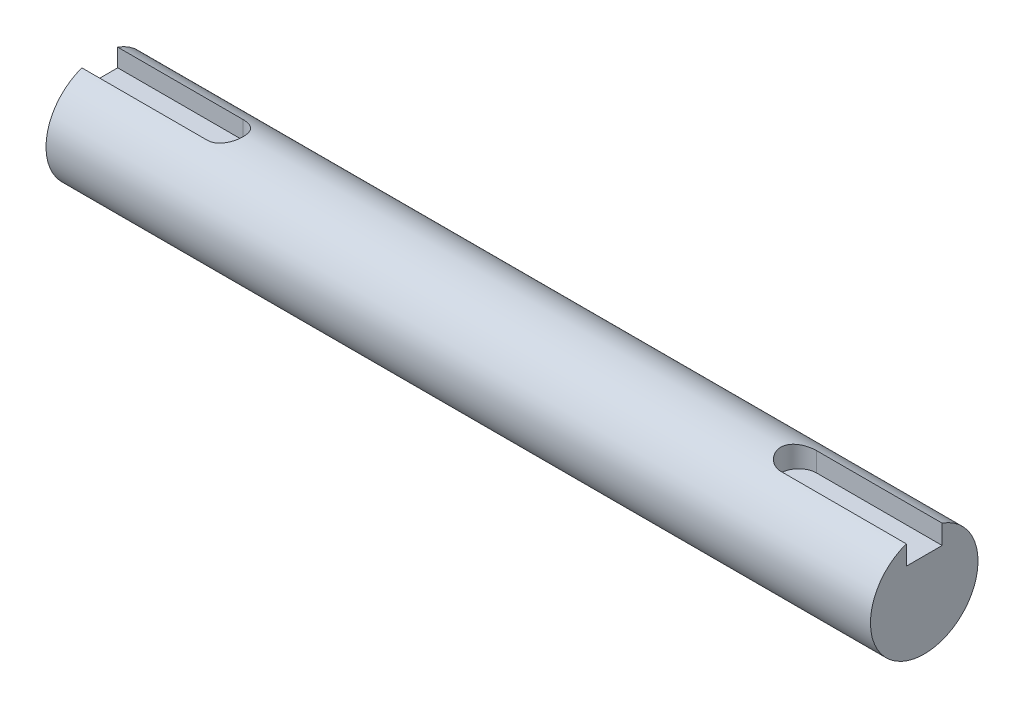
ISO-10303-21;
HEADER;
FILE_DESCRIPTION(('STEP AP214'),'2;1');
FILE_NAME('part.step','',(''),(''),'','','');
FILE_SCHEMA(('AUTOMOTIVE_DESIGN { 1 0 10303 214 1 1 1 1 }'));
ENDSEC;
DATA;
#1=APPLICATION_CONTEXT('core data for automotive mechanical design processes');
#2=APPLICATION_PROTOCOL_DEFINITION('international standard','automotive_design',2000,#1);
#3=PRODUCT_CONTEXT('',#1,'mechanical');
#4=PRODUCT('Part','Part','',(#3));
#5=PRODUCT_RELATED_PRODUCT_CATEGORY('part','',(#4));
#6=PRODUCT_DEFINITION_FORMATION('','',#4);
#7=PRODUCT_DEFINITION_CONTEXT('part definition',#1,'design');
#8=PRODUCT_DEFINITION('design','',#6,#7);
#9=PRODUCT_DEFINITION_SHAPE('','',#8);
#10=(LENGTH_UNIT() NAMED_UNIT(*) SI_UNIT(.MILLI.,.METRE.));
#11=(NAMED_UNIT(*) PLANE_ANGLE_UNIT() SI_UNIT($,.RADIAN.));
#12=(NAMED_UNIT(*) SI_UNIT($,.STERADIAN.) SOLID_ANGLE_UNIT());
#13=UNCERTAINTY_MEASURE_WITH_UNIT(LENGTH_MEASURE(1.E-05),#10,'distance_accuracy_value','');
#14=(GEOMETRIC_REPRESENTATION_CONTEXT(3) GLOBAL_UNCERTAINTY_ASSIGNED_CONTEXT((#13)) GLOBAL_UNIT_ASSIGNED_CONTEXT((#10,
#11,#12)) REPRESENTATION_CONTEXT('',''));
#15=CARTESIAN_POINT('',(0.,0.,0.));
#16=DIRECTION('',(0.,0.,1.));
#17=DIRECTION('',(1.,0.,0.));
#18=AXIS2_PLACEMENT_3D('',#15,#16,#17);
#19=CARTESIAN_POINT('',(115.,0.,0.));
#20=DIRECTION('',(-1.,0.,0.));
#21=DIRECTION('',(0.,0.,1.));
#22=AXIS2_PLACEMENT_3D('',#19,#20,#21);
#23=CYLINDRICAL_SURFACE('',#22,7.5);
#24=CARTESIAN_POINT('',(115.,0.,0.));
#25=DIRECTION('',(1.,0.,0.));
#26=DIRECTION('',(0.,0.,-1.));
#27=AXIS2_PLACEMENT_3D('',#24,#25,#26);
#28=CIRCLE('',#27,7.5);
#29=CARTESIAN_POINT('',(115.,7.07106781186542,2.49999999999989));
#30=VERTEX_POINT('',#29);
#31=CARTESIAN_POINT('',(115.,7.07106781186539,-2.50000000000006));
#32=VERTEX_POINT('',#31);
#33=EDGE_CURVE('E136',#30,#32,#28,.T.);
#34=ORIENTED_EDGE('',*,*,#33,.F.);
#35=DIRECTION('',(-1.,0.,0.));
#36=VECTOR('',#35,1.);
#37=CARTESIAN_POINT('',(115.,7.07106781186542,2.49999999999989));
#38=LINE('',#37,#36);
#39=CARTESIAN_POINT('',(97.5,7.07106781186551,2.49999999999995));
#40=VERTEX_POINT('',#39);
#41=EDGE_CURVE('E150',#30,#40,#38,.T.);
#42=ORIENTED_EDGE('',*,*,#41,.T.);
#43=CARTESIAN_POINT('',(97.5,7.07106781186551,2.49999999999995));
#44=CARTESIAN_POINT('',(97.4317929221797,7.07105693273155,2.50000899110396));
#45=CARTESIAN_POINT('',(97.3635919253246,7.07205443904565,2.49720887221574));
#46=CARTESIAN_POINT('',(97.2277189616507,7.07598524121002,2.48606045780459));
#47=CARTESIAN_POINT('',(97.1600468570119,7.07891801450638,2.47771365997191));
#48=CARTESIAN_POINT('',(97.0259095116454,7.08662705252502,2.45557459422784));
#49=CARTESIAN_POINT('',(96.9594412974491,7.09139784850113,2.44179847763122));
#50=CARTESIAN_POINT('',(96.8279917314172,7.10262619905999,2.40894181030109));
#51=CARTESIAN_POINT('',(96.7630104334101,7.10908381460331,2.38986106786025));
#52=CARTESIAN_POINT('',(96.5710384202854,7.13069940793916,2.32491551306193));
#53=CARTESIAN_POINT('',(96.44682084253,7.14811243884048,2.2713141681024));
#54=CARTESIAN_POINT('',(96.2091231885366,7.18697034087513,2.14517784106243));
#55=CARTESIAN_POINT('',(96.0956497642198,7.20841768551074,2.07263123268525));
#56=CARTESIAN_POINT('',(95.8782070965292,7.25386182389475,1.90762995846814));
#57=CARTESIAN_POINT('',(95.7747148572318,7.27792189428057,1.81456284630826));
#58=CARTESIAN_POINT('',(95.5844828967664,7.32534626726034,1.61247071190504));
#59=CARTESIAN_POINT('',(95.4977461586811,7.34871044533526,1.50344285413651));
#60=CARTESIAN_POINT('',(95.3413017757376,7.3928470609635,1.26900922493966));
#61=CARTESIAN_POINT('',(95.2720976922578,7.41353593532881,1.14325025284454));
#62=CARTESIAN_POINT('',(95.1560192175653,7.44924021883271,0.881073095475224));
#63=CARTESIAN_POINT('',(95.1091380050743,7.4642573608121,0.744658181225826));
#64=CARTESIAN_POINT('',(95.0406607237418,7.48647677762789,0.470073371182857));
#65=CARTESIAN_POINT('',(95.0182418290428,7.49393272446136,0.33212958815369));
#66=CARTESIAN_POINT('',(94.9967092432615,7.50109021034816,0.054247421636145));
#67=CARTESIAN_POINT('',(94.9975899990843,7.50079359709903,-0.0856904786402715));
#68=CARTESIAN_POINT('',(95.0221107104005,7.49265096581773,-0.357759612692468));
#69=CARTESIAN_POINT('',(95.0448565956047,7.48510152476435,-0.489981756428245));
#70=CARTESIAN_POINT('',(95.1109829959792,7.46367401253765,-0.748610161077404));
#71=CARTESIAN_POINT('',(95.1543646553253,7.44979559044795,-0.87501609907784));
#72=CARTESIAN_POINT('',(95.2610534241945,7.41689170677797,-1.12038155754045));
#73=CARTESIAN_POINT('',(95.3246151128576,7.39780094595646,-1.23922126412512));
#74=CARTESIAN_POINT('',(95.4696498784249,7.35645969200226,-1.46481147275374));
#75=CARTESIAN_POINT('',(95.5511278276021,7.33420833994022,-1.5715586742895));
#76=CARTESIAN_POINT('',(95.734177625007,7.28765679856817,-1.77524334927525));
#77=CARTESIAN_POINT('',(95.8365138590282,7.26330946699765,-1.87148402903107));
#78=CARTESIAN_POINT('',(96.0561037242864,7.21618726182128,-2.04568006205178));
#79=CARTESIAN_POINT('',(96.173362156007,7.19341289789392,-2.12362950795975));
#80=CARTESIAN_POINT('',(96.4217004458843,7.15175078440797,-2.26000831398178));
#81=CARTESIAN_POINT('',(96.5529587873326,7.13292537370575,-2.31813252376926));
#82=CARTESIAN_POINT('',(96.8241174439746,7.10202742655086,-2.41115057675294));
#83=CARTESIAN_POINT('',(96.9640037334303,7.08994423522486,-2.4460810901384));
#84=CARTESIAN_POINT('',(97.17104659187,7.07841355236797,-2.47914539070212));
#85=CARTESIAN_POINT('',(97.2366034746356,7.07566669236495,-2.48696265313788));
#86=CARTESIAN_POINT('',(97.3680951959995,7.07199258928482,-2.49738654017813));
#87=CARTESIAN_POINT('',(97.434029436361,7.07106299823806,-2.49999988848758));
#88=CARTESIAN_POINT('',(97.5,7.07106781186548,-2.50000000000006));
#89=B_SPLINE_CURVE_WITH_KNOTS('',3,(#43,#44,#45,#46,#47,#48,#49,#50,#51,#52,#53,#54,#55,#56,#57,
#58,#59,#60,#61,#62,#63,#64,#65,#66,#67,#68,#69,#70,#71,#72,#73,#74,#75,#76,#77,#78,#79,#80,#81,
#82,#83,#84,#85,#86,#87,#88),.UNSPECIFIED.,.F.,.F.,(4,2,2,2,2,2,2,2,2,2,2,2,2,2,2,2,2,2,2,2,2,2,
4),(0.,0.204546211838589,0.409037215423664,0.612924429429115,0.816819012805419,1.22401016923255,
1.63145179965519,2.05327864088385,2.4751805134106,2.90809434014445,3.34087579484509,
3.75860278500198,4.17623021758297,4.57747647846031,4.97874498952315,5.38529148746612,
5.79194868153613,6.21771736826817,6.64362337304795,7.0758167650179,7.50732520398793,
7.70536340013573,7.90314555504336),.UNSPECIFIED.);
#90=CARTESIAN_POINT('',(97.5,7.07106781186548,-2.50000000000006));
#91=VERTEX_POINT('',#90);
#92=EDGE_CURVE('E11',#40,#91,#89,.T.);
#93=ORIENTED_EDGE('',*,*,#92,.T.);
#94=DIRECTION('',(-1.,0.,0.));
#95=VECTOR('',#94,1.);
#96=CARTESIAN_POINT('',(115.,7.07106781186539,-2.50000000000006));
#97=LINE('',#96,#95);
#98=EDGE_CURVE('E147',#91,#32,#97,.F.);
#99=ORIENTED_EDGE('',*,*,#98,.T.);
#100=EDGE_LOOP('',(#34,#42,#93,#99));
#101=FACE_BOUND('',#100,.T.);
#102=CARTESIAN_POINT('',(0.,0.,0.));
#103=DIRECTION('',(1.,0.,0.));
#104=DIRECTION('',(0.,0.,-1.));
#105=AXIS2_PLACEMENT_3D('',#102,#103,#104);
#106=CIRCLE('',#105,7.5);
#107=CARTESIAN_POINT('',(0.,7.07106781186548,2.49999999999995));
#108=VERTEX_POINT('',#107);
#109=CARTESIAN_POINT('',(0.,7.07106781186548,-2.50000000000017));
#110=VERTEX_POINT('',#109);
#111=EDGE_CURVE('E187',#108,#110,#106,.T.);
#112=ORIENTED_EDGE('',*,*,#111,.T.);
#113=DIRECTION('',(-1.,0.,0.));
#114=VECTOR('',#113,1.);
#115=CARTESIAN_POINT('',(115.,7.07106781186539,-2.50000000000006));
#116=LINE('',#115,#114);
#117=CARTESIAN_POINT('',(17.5,7.07106781186542,-2.50000000000006));
#118=VERTEX_POINT('',#117);
#119=EDGE_CURVE('E183',#110,#118,#116,.F.);
#120=ORIENTED_EDGE('',*,*,#119,.T.);
#121=CARTESIAN_POINT('',(17.5,7.07106781186542,-2.50000000000006));
#122=CARTESIAN_POINT('',(17.5682070778203,7.07105693273147,-2.50000899110415));
#123=CARTESIAN_POINT('',(17.6364080746754,7.07205443904558,-2.49720887221595));
#124=CARTESIAN_POINT('',(17.7722810383493,7.07598524120995,-2.48606045780482));
#125=CARTESIAN_POINT('',(17.8399531429881,7.0789180145063,-2.47771365997213));
#126=CARTESIAN_POINT('',(17.9740904883546,7.08662705252495,-2.45557459422806));
#127=CARTESIAN_POINT('',(18.0405587025509,7.09139784850106,-2.44179847763148));
#128=CARTESIAN_POINT('',(18.1720082685828,7.10262619905991,-2.4089418103013));
#129=CARTESIAN_POINT('',(18.2369895665899,7.10908381460321,-2.38986106786039));
#130=CARTESIAN_POINT('',(18.4289615797146,7.13069940793903,-2.32491551306199));
#131=CARTESIAN_POINT('',(18.55317915747,7.1481124388404,-2.27131416810259));
#132=CARTESIAN_POINT('',(18.7908768114634,7.18697034087509,-2.14517784106266));
#133=CARTESIAN_POINT('',(18.9043502357802,7.2084176855107,-2.07263123268539));
#134=CARTESIAN_POINT('',(19.1217929034708,7.25386182389473,-1.90762995846825));
#135=CARTESIAN_POINT('',(19.2252851427682,7.27792189428056,-1.81456284630842));
#136=CARTESIAN_POINT('',(19.4155171032337,7.32534626726027,-1.61247071190525));
#137=CARTESIAN_POINT('',(19.502253841319,7.34871044533512,-1.50344285413672));
#138=CARTESIAN_POINT('',(19.6586982242625,7.39284706096338,-1.26900922493986));
#139=CARTESIAN_POINT('',(19.7279023077423,7.41353593532878,-1.14325025284474));
#140=CARTESIAN_POINT('',(19.8439807824347,7.44924021883269,-0.881073095475382));
#141=CARTESIAN_POINT('',(19.8908619949257,7.46425736081199,-0.744658181225958));
#142=CARTESIAN_POINT('',(19.9593392762583,7.48647677762778,-0.470073371182964));
#143=CARTESIAN_POINT('',(19.9817581709572,7.49393272446133,-0.3321295881538));
#144=CARTESIAN_POINT('',(20.0032907567385,7.50109021034819,-0.0542474216362545));
#145=CARTESIAN_POINT('',(20.0024100009158,7.50079359709902,0.0856904786401634));
#146=CARTESIAN_POINT('',(19.9778892895995,7.49265096581773,0.357759612692347));
#147=CARTESIAN_POINT('',(19.9551434043953,7.48510152476439,0.48998175642811));
#148=CARTESIAN_POINT('',(19.8890170040208,7.46367401253763,0.748610161077251));
#149=CARTESIAN_POINT('',(19.8456353446748,7.44979559044786,0.875016099077683));
#150=CARTESIAN_POINT('',(19.7389465758056,7.4168917067779,1.12038155754027));
#151=CARTESIAN_POINT('',(19.6753848871424,7.3978009459565,1.23922126412493));
#152=CARTESIAN_POINT('',(19.530350121575,7.35645969200229,1.46481147275353));
#153=CARTESIAN_POINT('',(19.4488721723979,7.33420833994012,1.57155867428929));
#154=CARTESIAN_POINT('',(19.2658223749931,7.28765679856809,1.77524334927503));
#155=CARTESIAN_POINT('',(19.1634861409718,7.26330946699772,1.87148402903085));
#156=CARTESIAN_POINT('',(18.9438962757136,7.2161872618213,2.04568006205164));
#157=CARTESIAN_POINT('',(18.826637843993,7.19341289789376,2.1236295079597));
#158=CARTESIAN_POINT('',(18.5782995541157,7.15175078440781,2.26000831398171));
#159=CARTESIAN_POINT('',(18.4470412126674,7.13292537370578,2.31813252376905));
#160=CARTESIAN_POINT('',(18.1758825560254,7.10202742655096,2.41115057675274));
#161=CARTESIAN_POINT('',(18.0359962665697,7.08994423522483,2.44608109013834));
#162=CARTESIAN_POINT('',(17.82895340813,7.07841355236798,2.47914539070198));
#163=CARTESIAN_POINT('',(17.7633965253644,7.07566669236501,2.48696265313768));
#164=CARTESIAN_POINT('',(17.6319048040005,7.07199258928492,2.49738654017788));
#165=CARTESIAN_POINT('',(17.565970563639,7.07106299823815,2.49999988848734));
#166=CARTESIAN_POINT('',(17.5,7.07106781186545,2.49999999999995));
#167=B_SPLINE_CURVE_WITH_KNOTS('',3,(#121,#122,#123,#124,#125,#126,#127,#128,#129,#130,#131,
#132,#133,#134,#135,#136,#137,#138,#139,#140,#141,#142,#143,#144,#145,#146,#147,#148,#149,#150,
#151,#152,#153,#154,#155,#156,#157,#158,#159,#160,#161,#162,#163,#164,#165,#166),.UNSPECIFIED.,
.F.,.F.,(4,2,2,2,2,2,2,2,2,2,2,2,2,2,2,2,2,2,2,2,2,2,4),(0.,0.204546211838591,0.409037215423656,
0.612924429429071,0.81681901280539,1.22401016923256,1.63145179965526,2.05327864088388,
2.47518051341058,2.90809434014447,3.34087579484517,3.75860278500207,4.17623021758305,
4.57747647846037,4.97874498952318,5.38529148746613,5.79194868153611,6.2177173682682,
6.64362337304803,7.07581676501797,7.50732520398795,7.70536340013576,7.90314555504337),.UNSPECIFIED.);
#168=CARTESIAN_POINT('',(17.5,7.07106781186545,2.49999999999995));
#169=VERTEX_POINT('',#168);
#170=EDGE_CURVE('E122',#118,#169,#167,.T.);
#171=ORIENTED_EDGE('',*,*,#170,.T.);
#172=DIRECTION('',(-1.,0.,0.));
#173=VECTOR('',#172,1.);
#174=CARTESIAN_POINT('',(115.,7.07106781186542,2.49999999999989));
#175=LINE('',#174,#173);
#176=EDGE_CURVE('E169',#169,#108,#175,.T.);
#177=ORIENTED_EDGE('',*,*,#176,.T.);
#178=EDGE_LOOP('',(#112,#120,#171,#177));
#179=FACE_BOUND('',#178,.T.);
#180=ADVANCED_FACE('F43',(#101,#179),#23,.T.);
#181=CARTESIAN_POINT('',(115.,0.,0.));
#182=DIRECTION('',(1.,0.,0.));
#183=DIRECTION('',(0.,0.,-1.));
#184=AXIS2_PLACEMENT_3D('',#181,#182,#183);
#185=PLANE('',#184);
#186=DIRECTION('',(0.,1.,0.));
#187=VECTOR('',#186,1.);
#188=CARTESIAN_POINT('',(115.,4.37106781186541,2.49999999999995));
#189=LINE('',#188,#187);
#190=CARTESIAN_POINT('',(115.,4.37106781186541,2.49999999999995));
#191=VERTEX_POINT('',#190);
#192=EDGE_CURVE('E151',#191,#30,#189,.T.);
#193=ORIENTED_EDGE('',*,*,#192,.T.);
#194=ORIENTED_EDGE('',*,*,#33,.T.);
#195=DIRECTION('',(0.,1.,0.));
#196=VECTOR('',#195,1.);
#197=CARTESIAN_POINT('',(115.,4.37106781186544,-2.50000000000006));
#198=LINE('',#197,#196);
#199=CARTESIAN_POINT('',(115.,4.37106781186544,-2.50000000000006));
#200=VERTEX_POINT('',#199);
#201=EDGE_CURVE('E125',#200,#32,#198,.T.);
#202=ORIENTED_EDGE('',*,*,#201,.F.);
#203=DIRECTION('',(0.,0.,1.));
#204=VECTOR('',#203,1.);
#205=CARTESIAN_POINT('',(115.,4.37106781186539,-1.11022302462516E-13));
#206=LINE('',#205,#204);
#207=EDGE_CURVE('E57',#200,#191,#206,.T.);
#208=ORIENTED_EDGE('',*,*,#207,.T.);
#209=EDGE_LOOP('',(#193,#194,#202,#208));
#210=FACE_BOUND('',#209,.T.);
#211=ADVANCED_FACE('F134',(#210),#185,.T.);
#212=CARTESIAN_POINT('',(0.,0.,0.));
#213=DIRECTION('',(1.,0.,0.));
#214=DIRECTION('',(0.,0.,-1.));
#215=AXIS2_PLACEMENT_3D('',#212,#213,#214);
#216=PLANE('',#215);
#217=DIRECTION('',(0.,0.,1.));
#218=VECTOR('',#217,1.);
#219=CARTESIAN_POINT('',(0.,4.5710678118655,-1.11022302462516E-13));
#220=LINE('',#219,#218);
#221=CARTESIAN_POINT('',(0.,4.57106781186548,-2.50000000000006));
#222=VERTEX_POINT('',#221);
#223=CARTESIAN_POINT('',(0.,4.57106781186548,2.49999999999995));
#224=VERTEX_POINT('',#223);
#225=EDGE_CURVE('E190',#222,#224,#220,.T.);
#226=ORIENTED_EDGE('',*,*,#225,.F.);
#227=DIRECTION('',(0.,1.,0.));
#228=VECTOR('',#227,1.);
#229=CARTESIAN_POINT('',(0.,4.57106781186548,-2.50000000000006));
#230=LINE('',#229,#228);
#231=EDGE_CURVE('E165',#222,#110,#230,.T.);
#232=ORIENTED_EDGE('',*,*,#231,.T.);
#233=ORIENTED_EDGE('',*,*,#111,.F.);
#234=DIRECTION('',(0.,1.,0.));
#235=VECTOR('',#234,1.);
#236=CARTESIAN_POINT('',(0.,4.57106781186548,2.49999999999995));
#237=LINE('',#236,#235);
#238=EDGE_CURVE('E164',#224,#108,#237,.T.);
#239=ORIENTED_EDGE('',*,*,#238,.F.);
#240=EDGE_LOOP('',(#226,#232,#233,#239));
#241=FACE_BOUND('',#240,.T.);
#242=ADVANCED_FACE('F209',(#241),#216,.F.);
#243=CARTESIAN_POINT('',(17.5,4.57106781186542,-1.11022302462516E-13));
#244=DIRECTION('',(0.,1.,0.));
#245=DIRECTION('',(0.,0.,1.));
#246=AXIS2_PLACEMENT_3D('',#243,#244,#245);
#247=CYLINDRICAL_SURFACE('',#246,2.5);
#248=DIRECTION('',(0.,1.,0.));
#249=VECTOR('',#248,1.);
#250=CARTESIAN_POINT('',(17.5,4.57106781186539,-2.50000000000017));
#251=LINE('',#250,#249);
#252=CARTESIAN_POINT('',(17.5,4.57106781186539,-2.50000000000017));
#253=VERTEX_POINT('',#252);
#254=EDGE_CURVE('E170',#253,#118,#251,.T.);
#255=ORIENTED_EDGE('',*,*,#254,.F.);
#256=CARTESIAN_POINT('',(17.5,4.57106781186542,-1.11022302462516E-13));
#257=DIRECTION('',(0.,1.,0.));
#258=DIRECTION('',(0.,0.,1.));
#259=AXIS2_PLACEMENT_3D('',#256,#257,#258);
#260=CIRCLE('',#259,2.5);
#261=CARTESIAN_POINT('',(17.5,4.57106781186542,2.49999999999995));
#262=VERTEX_POINT('',#261);
#263=EDGE_CURVE('E159',#262,#253,#260,.T.);
#264=ORIENTED_EDGE('',*,*,#263,.F.);
#265=DIRECTION('',(0.,1.,0.));
#266=VECTOR('',#265,1.);
#267=CARTESIAN_POINT('',(17.5,4.57106781186542,2.49999999999995));
#268=LINE('',#267,#266);
#269=EDGE_CURVE('E174',#262,#169,#268,.T.);
#270=ORIENTED_EDGE('',*,*,#269,.T.);
#271=ORIENTED_EDGE('',*,*,#170,.F.);
#272=EDGE_LOOP('',(#255,#264,#270,#271));
#273=FACE_BOUND('',#272,.T.);
#274=ADVANCED_FACE('F203',(#273),#247,.F.);
#275=CARTESIAN_POINT('',(0.,4.57106781186548,-2.50000000000006));
#276=DIRECTION('',(0.,0.,-1.));
#277=DIRECTION('',(-1.,0.,0.));
#278=AXIS2_PLACEMENT_3D('',#275,#276,#277);
#279=PLANE('',#278);
#280=ORIENTED_EDGE('',*,*,#231,.F.);
#281=DIRECTION('',(-1.,0.,0.));
#282=VECTOR('',#281,1.);
#283=CARTESIAN_POINT('',(0.,4.57106781186548,-2.50000000000006));
#284=LINE('',#283,#282);
#285=EDGE_CURVE('E72',#253,#222,#284,.T.);
#286=ORIENTED_EDGE('',*,*,#285,.F.);
#287=ORIENTED_EDGE('',*,*,#254,.T.);
#288=ORIENTED_EDGE('',*,*,#119,.F.);
#289=EDGE_LOOP('',(#280,#286,#287,#288));
#290=FACE_BOUND('',#289,.T.);
#291=ADVANCED_FACE('F208',(#290),#279,.F.);
#292=CARTESIAN_POINT('',(0.,4.57106781186548,2.49999999999995));
#293=DIRECTION('',(0.,0.,1.));
#294=DIRECTION('',(1.,0.,0.));
#295=AXIS2_PLACEMENT_3D('',#292,#293,#294);
#296=PLANE('',#295);
#297=ORIENTED_EDGE('',*,*,#269,.F.);
#298=DIRECTION('',(1.,0.,0.));
#299=VECTOR('',#298,1.);
#300=CARTESIAN_POINT('',(0.,4.57106781186548,2.49999999999995));
#301=LINE('',#300,#299);
#302=EDGE_CURVE('E155',#224,#262,#301,.T.);
#303=ORIENTED_EDGE('',*,*,#302,.F.);
#304=ORIENTED_EDGE('',*,*,#238,.T.);
#305=ORIENTED_EDGE('',*,*,#176,.F.);
#306=EDGE_LOOP('',(#297,#303,#304,#305));
#307=FACE_BOUND('',#306,.T.);
#308=ADVANCED_FACE('F212',(#307),#296,.F.);
#309=CARTESIAN_POINT('',(0.,4.5710678118655,-1.11022302462516E-13));
#310=DIRECTION('',(0.,1.,0.));
#311=DIRECTION('',(0.,0.,1.));
#312=AXIS2_PLACEMENT_3D('',#309,#310,#311);
#313=PLANE('',#312);
#314=ORIENTED_EDGE('',*,*,#225,.T.);
#315=ORIENTED_EDGE('',*,*,#302,.T.);
#316=ORIENTED_EDGE('',*,*,#263,.T.);
#317=ORIENTED_EDGE('',*,*,#285,.T.);
#318=EDGE_LOOP('',(#314,#315,#316,#317));
#319=FACE_BOUND('',#318,.T.);
#320=ADVANCED_FACE('F215',(#319),#313,.T.);
#321=CARTESIAN_POINT('',(97.5,4.3710678118655,-1.11022302462516E-13));
#322=DIRECTION('',(0.,1.,0.));
#323=DIRECTION('',(0.,0.,1.));
#324=AXIS2_PLACEMENT_3D('',#321,#322,#323);
#325=CYLINDRICAL_SURFACE('',#324,2.5);
#326=DIRECTION('',(0.,1.,0.));
#327=VECTOR('',#326,1.);
#328=CARTESIAN_POINT('',(97.5,4.3710678118655,2.49999999999989));
#329=LINE('',#328,#327);
#330=CARTESIAN_POINT('',(97.5,4.3710678118655,2.49999999999989));
#331=VERTEX_POINT('',#330);
#332=EDGE_CURVE('E142',#331,#40,#329,.T.);
#333=ORIENTED_EDGE('',*,*,#332,.F.);
#334=CARTESIAN_POINT('',(97.5,4.3710678118655,-1.11022302462516E-13));
#335=DIRECTION('',(0.,1.,0.));
#336=DIRECTION('',(0.,0.,1.));
#337=AXIS2_PLACEMENT_3D('',#334,#335,#336);
#338=CIRCLE('',#337,2.5);
#339=CARTESIAN_POINT('',(97.5,4.37106781186547,-2.50000000000006));
#340=VERTEX_POINT('',#339);
#341=EDGE_CURVE('E131',#340,#331,#338,.T.);
#342=ORIENTED_EDGE('',*,*,#341,.F.);
#343=DIRECTION('',(0.,1.,0.));
#344=VECTOR('',#343,1.);
#345=CARTESIAN_POINT('',(97.5,4.37106781186547,-2.50000000000006));
#346=LINE('',#345,#344);
#347=EDGE_CURVE('E128',#340,#91,#346,.T.);
#348=ORIENTED_EDGE('',*,*,#347,.T.);
#349=ORIENTED_EDGE('',*,*,#92,.F.);
#350=EDGE_LOOP('',(#333,#342,#348,#349));
#351=FACE_BOUND('',#350,.T.);
#352=ADVANCED_FACE('F234',(#351),#325,.F.);
#353=CARTESIAN_POINT('',(115.,4.37106781186541,2.49999999999995));
#354=DIRECTION('',(0.,0.,1.));
#355=DIRECTION('',(1.,0.,0.));
#356=AXIS2_PLACEMENT_3D('',#353,#354,#355);
#357=PLANE('',#356);
#358=ORIENTED_EDGE('',*,*,#192,.F.);
#359=DIRECTION('',(1.,0.,0.));
#360=VECTOR('',#359,1.);
#361=CARTESIAN_POINT('',(115.,4.37106781186541,2.49999999999995));
#362=LINE('',#361,#360);
#363=EDGE_CURVE('E64',#331,#191,#362,.T.);
#364=ORIENTED_EDGE('',*,*,#363,.F.);
#365=ORIENTED_EDGE('',*,*,#332,.T.);
#366=ORIENTED_EDGE('',*,*,#41,.F.);
#367=EDGE_LOOP('',(#358,#364,#365,#366));
#368=FACE_BOUND('',#367,.T.);
#369=ADVANCED_FACE('F238',(#368),#357,.F.);
#370=CARTESIAN_POINT('',(115.,4.37106781186544,-2.50000000000006));
#371=DIRECTION('',(0.,0.,-1.));
#372=DIRECTION('',(-1.,0.,0.));
#373=AXIS2_PLACEMENT_3D('',#370,#371,#372);
#374=PLANE('',#373);
#375=ORIENTED_EDGE('',*,*,#347,.F.);
#376=DIRECTION('',(-1.,0.,0.));
#377=VECTOR('',#376,1.);
#378=CARTESIAN_POINT('',(115.,4.37106781186544,-2.50000000000006));
#379=LINE('',#378,#377);
#380=EDGE_CURVE('E117',#200,#340,#379,.T.);
#381=ORIENTED_EDGE('',*,*,#380,.F.);
#382=ORIENTED_EDGE('',*,*,#201,.T.);
#383=ORIENTED_EDGE('',*,*,#98,.F.);
#384=EDGE_LOOP('',(#375,#381,#382,#383));
#385=FACE_BOUND('',#384,.T.);
#386=ADVANCED_FACE('F124',(#385),#374,.F.);
#387=CARTESIAN_POINT('',(115.,4.37106781186539,-1.11022302462516E-13));
#388=DIRECTION('',(0.,1.,0.));
#389=DIRECTION('',(0.,0.,1.));
#390=AXIS2_PLACEMENT_3D('',#387,#388,#389);
#391=PLANE('',#390);
#392=ORIENTED_EDGE('',*,*,#380,.T.);
#393=ORIENTED_EDGE('',*,*,#341,.T.);
#394=ORIENTED_EDGE('',*,*,#363,.T.);
#395=ORIENTED_EDGE('',*,*,#207,.F.);
#396=EDGE_LOOP('',(#392,#393,#394,#395));
#397=FACE_BOUND('',#396,.T.);
#398=ADVANCED_FACE('F116',(#397),#391,.T.);
#399=CLOSED_SHELL('',(#180,#211,#242,#274,#291,#308,#320,#352,#369,#386,#398));
#400=MANIFOLD_SOLID_BREP('B2',#399);
#401=ADVANCED_BREP_SHAPE_REPRESENTATION('',(#18,#400),#14);
#402=SHAPE_DEFINITION_REPRESENTATION(#9,#401);
ENDSEC;
END-ISO-10303-21;
